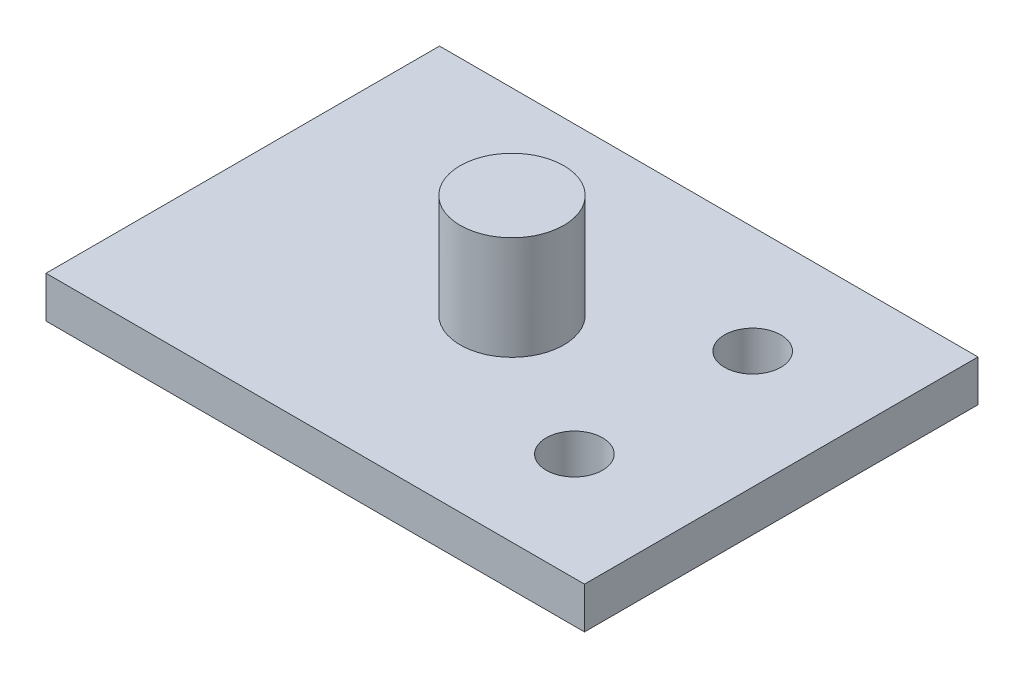
ISO-10303-21;
HEADER;
FILE_DESCRIPTION(('STEP AP214'),'2;1');
FILE_NAME('part.step','',(''),(''),'','','');
FILE_SCHEMA(('AUTOMOTIVE_DESIGN { 1 0 10303 214 1 1 1 1 }'));
ENDSEC;
DATA;
#1=APPLICATION_CONTEXT('core data for automotive mechanical design processes');
#2=APPLICATION_PROTOCOL_DEFINITION('international standard','automotive_design',2000,#1);
#3=PRODUCT_CONTEXT('',#1,'mechanical');
#4=PRODUCT('Part','Part','',(#3));
#5=PRODUCT_RELATED_PRODUCT_CATEGORY('part','',(#4));
#6=PRODUCT_DEFINITION_FORMATION('','',#4);
#7=PRODUCT_DEFINITION_CONTEXT('part definition',#1,'design');
#8=PRODUCT_DEFINITION('design','',#6,#7);
#9=PRODUCT_DEFINITION_SHAPE('','',#8);
#10=(LENGTH_UNIT() NAMED_UNIT(*) SI_UNIT(.MILLI.,.METRE.));
#11=(NAMED_UNIT(*) PLANE_ANGLE_UNIT() SI_UNIT($,.RADIAN.));
#12=(NAMED_UNIT(*) SI_UNIT($,.STERADIAN.) SOLID_ANGLE_UNIT());
#13=UNCERTAINTY_MEASURE_WITH_UNIT(LENGTH_MEASURE(1.E-05),#10,'distance_accuracy_value','');
#14=(GEOMETRIC_REPRESENTATION_CONTEXT(3) GLOBAL_UNCERTAINTY_ASSIGNED_CONTEXT((#13)) GLOBAL_UNIT_ASSIGNED_CONTEXT((#10,
#11,#12)) REPRESENTATION_CONTEXT('',''));
#15=CARTESIAN_POINT('',(0.,0.,0.));
#16=DIRECTION('',(0.,0.,1.));
#17=DIRECTION('',(1.,0.,0.));
#18=AXIS2_PLACEMENT_3D('',#15,#16,#17);
#19=CARTESIAN_POINT('',(16.51,2.54,12.065));
#20=DIRECTION('',(-1.,0.,0.));
#21=DIRECTION('',(0.,0.,1.));
#22=AXIS2_PLACEMENT_3D('',#19,#20,#21);
#23=PLANE('',#22);
#24=DIRECTION('',(0.,0.,-1.));
#25=VECTOR('',#24,1.);
#26=CARTESIAN_POINT('',(16.51,0.,12.065));
#27=LINE('',#26,#25);
#28=CARTESIAN_POINT('',(16.51,0.,12.065));
#29=VERTEX_POINT('',#28);
#30=CARTESIAN_POINT('',(16.51,0.,-12.065));
#31=VERTEX_POINT('',#30);
#32=EDGE_CURVE('E99',#29,#31,#27,.T.);
#33=ORIENTED_EDGE('',*,*,#32,.T.);
#34=DIRECTION('',(0.,-1.,0.));
#35=VECTOR('',#34,1.);
#36=CARTESIAN_POINT('',(16.51,2.54,-12.065));
#37=LINE('',#36,#35);
#38=CARTESIAN_POINT('',(16.51,2.54,-12.065));
#39=VERTEX_POINT('',#38);
#40=EDGE_CURVE('E41',#39,#31,#37,.T.);
#41=ORIENTED_EDGE('',*,*,#40,.F.);
#42=DIRECTION('',(0.,0.,-1.));
#43=VECTOR('',#42,1.);
#44=CARTESIAN_POINT('',(16.51,2.54,12.065));
#45=LINE('',#44,#43);
#46=CARTESIAN_POINT('',(16.51,2.54,12.065));
#47=VERTEX_POINT('',#46);
#48=EDGE_CURVE('E85',#47,#39,#45,.T.);
#49=ORIENTED_EDGE('',*,*,#48,.F.);
#50=DIRECTION('',(0.,-1.,0.));
#51=VECTOR('',#50,1.);
#52=CARTESIAN_POINT('',(16.51,2.54,12.065));
#53=LINE('',#52,#51);
#54=EDGE_CURVE('E95',#47,#29,#53,.T.);
#55=ORIENTED_EDGE('',*,*,#54,.T.);
#56=EDGE_LOOP('',(#33,#41,#49,#55));
#57=FACE_BOUND('',#56,.T.);
#58=ADVANCED_FACE('F33',(#57),#23,.F.);
#59=CARTESIAN_POINT('',(-16.51,2.54,-12.065));
#60=DIRECTION('',(0.,0.,1.));
#61=DIRECTION('',(1.,0.,0.));
#62=AXIS2_PLACEMENT_3D('',#59,#60,#61);
#63=PLANE('',#62);
#64=DIRECTION('',(-1.,0.,0.));
#65=VECTOR('',#64,1.);
#66=CARTESIAN_POINT('',(-16.51,0.,-12.065));
#67=LINE('',#66,#65);
#68=CARTESIAN_POINT('',(-16.51,0.,-12.065));
#69=VERTEX_POINT('',#68);
#70=EDGE_CURVE('E90',#31,#69,#67,.T.);
#71=ORIENTED_EDGE('',*,*,#70,.T.);
#72=DIRECTION('',(0.,-1.,0.));
#73=VECTOR('',#72,1.);
#74=CARTESIAN_POINT('',(-16.51,2.54,-12.065));
#75=LINE('',#74,#73);
#76=CARTESIAN_POINT('',(-16.51,2.54,-12.065));
#77=VERTEX_POINT('',#76);
#78=EDGE_CURVE('E88',#77,#69,#75,.T.);
#79=ORIENTED_EDGE('',*,*,#78,.F.);
#80=DIRECTION('',(-1.,0.,0.));
#81=VECTOR('',#80,1.);
#82=CARTESIAN_POINT('',(-16.51,2.54,-12.065));
#83=LINE('',#82,#81);
#84=EDGE_CURVE('E80',#39,#77,#83,.T.);
#85=ORIENTED_EDGE('',*,*,#84,.F.);
#86=ORIENTED_EDGE('',*,*,#40,.T.);
#87=EDGE_LOOP('',(#71,#79,#85,#86));
#88=FACE_BOUND('',#87,.T.);
#89=ADVANCED_FACE('F89',(#88),#63,.F.);
#90=CARTESIAN_POINT('',(-16.51,2.54,12.065));
#91=DIRECTION('',(1.,0.,0.));
#92=DIRECTION('',(0.,0.,-1.));
#93=AXIS2_PLACEMENT_3D('',#90,#91,#92);
#94=PLANE('',#93);
#95=DIRECTION('',(0.,0.,1.));
#96=VECTOR('',#95,1.);
#97=CARTESIAN_POINT('',(-16.51,0.,12.065));
#98=LINE('',#97,#96);
#99=CARTESIAN_POINT('',(-16.51,0.,12.065));
#100=VERTEX_POINT('',#99);
#101=EDGE_CURVE('E66',#69,#100,#98,.T.);
#102=ORIENTED_EDGE('',*,*,#101,.T.);
#103=DIRECTION('',(0.,-1.,0.));
#104=VECTOR('',#103,1.);
#105=CARTESIAN_POINT('',(-16.51,2.54,12.065));
#106=LINE('',#105,#104);
#107=CARTESIAN_POINT('',(-16.51,2.54,12.065));
#108=VERTEX_POINT('',#107);
#109=EDGE_CURVE('E91',#108,#100,#106,.T.);
#110=ORIENTED_EDGE('',*,*,#109,.F.);
#111=DIRECTION('',(0.,0.,1.));
#112=VECTOR('',#111,1.);
#113=CARTESIAN_POINT('',(-16.51,2.54,12.065));
#114=LINE('',#113,#112);
#115=EDGE_CURVE('E83',#77,#108,#114,.T.);
#116=ORIENTED_EDGE('',*,*,#115,.F.);
#117=ORIENTED_EDGE('',*,*,#78,.T.);
#118=EDGE_LOOP('',(#102,#110,#116,#117));
#119=FACE_BOUND('',#118,.T.);
#120=ADVANCED_FACE('F93',(#119),#94,.F.);
#121=CARTESIAN_POINT('',(-16.51,2.54,12.065));
#122=DIRECTION('',(0.,0.,-1.));
#123=DIRECTION('',(-1.,0.,0.));
#124=AXIS2_PLACEMENT_3D('',#121,#122,#123);
#125=PLANE('',#124);
#126=DIRECTION('',(1.,0.,0.));
#127=VECTOR('',#126,1.);
#128=CARTESIAN_POINT('',(-16.51,0.,12.065));
#129=LINE('',#128,#127);
#130=EDGE_CURVE('E72',#100,#29,#129,.T.);
#131=ORIENTED_EDGE('',*,*,#130,.T.);
#132=ORIENTED_EDGE('',*,*,#54,.F.);
#133=DIRECTION('',(1.,0.,0.));
#134=VECTOR('',#133,1.);
#135=CARTESIAN_POINT('',(-16.51,2.54,12.065));
#136=LINE('',#135,#134);
#137=EDGE_CURVE('E49',#108,#47,#136,.T.);
#138=ORIENTED_EDGE('',*,*,#137,.F.);
#139=ORIENTED_EDGE('',*,*,#109,.T.);
#140=EDGE_LOOP('',(#131,#132,#138,#139));
#141=FACE_BOUND('',#140,.T.);
#142=ADVANCED_FACE('F122',(#141),#125,.F.);
#143=CARTESIAN_POINT('',(0.,2.54,0.));
#144=DIRECTION('',(0.,-1.,0.));
#145=DIRECTION('',(0.,0.,-1.));
#146=AXIS2_PLACEMENT_3D('',#143,#144,#145);
#147=PLANE('',#146);
#148=CARTESIAN_POINT('',(9.29148661856516,2.54,-5.46666047404187));
#149=DIRECTION('',(0.,1.,0.));
#150=DIRECTION('',(0.,0.,1.));
#151=AXIS2_PLACEMENT_3D('',#148,#149,#150);
#152=CIRCLE('',#151,1.72719999999999);
#153=CARTESIAN_POINT('',(9.29148661856516,2.54,-3.73946047404188));
#154=VERTEX_POINT('',#153);
#155=EDGE_CURVE('E196',#154,#154,#152,.T.);
#156=ORIENTED_EDGE('',*,*,#155,.F.);
#157=EDGE_LOOP('',(#156));
#158=FACE_BOUND('',#157,.T.);
#159=CARTESIAN_POINT('',(9.29148661856515,2.54,5.46666047404187));
#160=DIRECTION('',(0.,1.,0.));
#161=DIRECTION('',(0.,0.,1.));
#162=AXIS2_PLACEMENT_3D('',#159,#160,#161);
#163=CIRCLE('',#162,1.72719999999999);
#164=CARTESIAN_POINT('',(9.29148661856515,2.54,7.19386047404186));
#165=VERTEX_POINT('',#164);
#166=EDGE_CURVE('E189',#165,#165,#163,.T.);
#167=ORIENTED_EDGE('',*,*,#166,.F.);
#168=EDGE_LOOP('',(#167));
#169=FACE_BOUND('',#168,.T.);
#170=CARTESIAN_POINT('',(0.,2.54,0.));
#171=DIRECTION('',(0.,-1.,0.));
#172=DIRECTION('',(0.,0.,-1.));
#173=AXIS2_PLACEMENT_3D('',#170,#171,#172);
#174=CIRCLE('',#173,3.175);
#175=CARTESIAN_POINT('',(0.,2.54,-3.175));
#176=VERTEX_POINT('',#175);
#177=EDGE_CURVE('E11',#176,#176,#174,.F.);
#178=ORIENTED_EDGE('',*,*,#177,.F.);
#179=EDGE_LOOP('',(#178));
#180=FACE_BOUND('',#179,.T.);
#181=ORIENTED_EDGE('',*,*,#48,.T.);
#182=ORIENTED_EDGE('',*,*,#84,.T.);
#183=ORIENTED_EDGE('',*,*,#115,.T.);
#184=ORIENTED_EDGE('',*,*,#137,.T.);
#185=EDGE_LOOP('',(#181,#182,#183,#184));
#186=FACE_BOUND('',#185,.T.);
#187=ADVANCED_FACE('F81',(#158,#169,#180,#186),#147,.F.);
#188=CARTESIAN_POINT('',(0.,0.,0.));
#189=DIRECTION('',(0.,-1.,0.));
#190=DIRECTION('',(0.,0.,-1.));
#191=AXIS2_PLACEMENT_3D('',#188,#189,#190);
#192=PLANE('',#191);
#193=CARTESIAN_POINT('',(9.29148661856516,0.,-5.46666047404187));
#194=DIRECTION('',(0.,1.,0.));
#195=DIRECTION('',(0.,0.,1.));
#196=AXIS2_PLACEMENT_3D('',#193,#194,#195);
#197=CIRCLE('',#196,1.7272);
#198=CARTESIAN_POINT('',(9.29148661856516,0.,-3.73946047404187));
#199=VERTEX_POINT('',#198);
#200=EDGE_CURVE('E194',#199,#199,#197,.T.);
#201=ORIENTED_EDGE('',*,*,#200,.T.);
#202=EDGE_LOOP('',(#201));
#203=FACE_BOUND('',#202,.T.);
#204=CARTESIAN_POINT('',(9.29148661856515,0.,5.46666047404187));
#205=DIRECTION('',(0.,1.,0.));
#206=DIRECTION('',(0.,0.,1.));
#207=AXIS2_PLACEMENT_3D('',#204,#205,#206);
#208=CIRCLE('',#207,1.7272);
#209=CARTESIAN_POINT('',(9.29148661856515,0.,7.19386047404187));
#210=VERTEX_POINT('',#209);
#211=EDGE_CURVE('E186',#210,#210,#208,.T.);
#212=ORIENTED_EDGE('',*,*,#211,.T.);
#213=EDGE_LOOP('',(#212));
#214=FACE_BOUND('',#213,.T.);
#215=ORIENTED_EDGE('',*,*,#32,.F.);
#216=ORIENTED_EDGE('',*,*,#130,.F.);
#217=ORIENTED_EDGE('',*,*,#101,.F.);
#218=ORIENTED_EDGE('',*,*,#70,.F.);
#219=EDGE_LOOP('',(#215,#216,#217,#218));
#220=FACE_BOUND('',#219,.T.);
#221=ADVANCED_FACE('F110',(#203,#214,#220),#192,.T.);
#222=CARTESIAN_POINT('',(0.,8.89,0.));
#223=DIRECTION('',(0.,-1.,0.));
#224=DIRECTION('',(0.,0.,-1.));
#225=AXIS2_PLACEMENT_3D('',#222,#223,#224);
#226=CYLINDRICAL_SURFACE('',#225,3.175);
#227=CARTESIAN_POINT('',(0.,8.89,0.));
#228=DIRECTION('',(0.,1.,0.));
#229=DIRECTION('',(0.,0.,1.));
#230=AXIS2_PLACEMENT_3D('',#227,#228,#229);
#231=CIRCLE('',#230,3.175);
#232=CARTESIAN_POINT('',(0.,8.89,3.175));
#233=VERTEX_POINT('',#232);
#234=EDGE_CURVE('E102',#233,#233,#231,.T.);
#235=ORIENTED_EDGE('',*,*,#234,.F.);
#236=EDGE_LOOP('',(#235));
#237=FACE_BOUND('',#236,.T.);
#238=ORIENTED_EDGE('',*,*,#177,.T.);
#239=EDGE_LOOP('',(#238));
#240=FACE_BOUND('',#239,.T.);
#241=ADVANCED_FACE('F112',(#237,#240),#226,.T.);
#242=CARTESIAN_POINT('',(0.,8.89,0.));
#243=DIRECTION('',(0.,1.,0.));
#244=DIRECTION('',(0.,0.,1.));
#245=AXIS2_PLACEMENT_3D('',#242,#243,#244);
#246=PLANE('',#245);
#247=ORIENTED_EDGE('',*,*,#234,.T.);
#248=EDGE_LOOP('',(#247));
#249=FACE_BOUND('',#248,.T.);
#250=ADVANCED_FACE('F119',(#249),#246,.T.);
#251=CARTESIAN_POINT('',(9.29148661856515,2.54,5.46666047404187));
#252=DIRECTION('',(0.,1.,0.));
#253=DIRECTION('',(0.,0.,1.));
#254=AXIS2_PLACEMENT_3D('',#251,#252,#253);
#255=CYLINDRICAL_SURFACE('',#254,1.72719999999999);
#256=ORIENTED_EDGE('',*,*,#211,.F.);
#257=EDGE_LOOP('',(#256));
#258=FACE_BOUND('',#257,.T.);
#259=ORIENTED_EDGE('',*,*,#166,.T.);
#260=EDGE_LOOP('',(#259));
#261=FACE_BOUND('',#260,.T.);
#262=ADVANCED_FACE('F160',(#258,#261),#255,.F.);
#263=CARTESIAN_POINT('',(9.29148661856516,2.54,-5.46666047404187));
#264=DIRECTION('',(0.,1.,0.));
#265=DIRECTION('',(0.,0.,1.));
#266=AXIS2_PLACEMENT_3D('',#263,#264,#265);
#267=CYLINDRICAL_SURFACE('',#266,1.72719999999999);
#268=ORIENTED_EDGE('',*,*,#200,.F.);
#269=EDGE_LOOP('',(#268));
#270=FACE_BOUND('',#269,.T.);
#271=ORIENTED_EDGE('',*,*,#155,.T.);
#272=EDGE_LOOP('',(#271));
#273=FACE_BOUND('',#272,.T.);
#274=ADVANCED_FACE('F165',(#270,#273),#267,.F.);
#275=CLOSED_SHELL('',(#58,#89,#120,#142,#187,#221,#241,#250,#262,#274));
#276=MANIFOLD_SOLID_BREP('B2',#275);
#277=ADVANCED_BREP_SHAPE_REPRESENTATION('',(#18,#276),#14);
#278=SHAPE_DEFINITION_REPRESENTATION(#9,#277);
ENDSEC;
END-ISO-10303-21;
